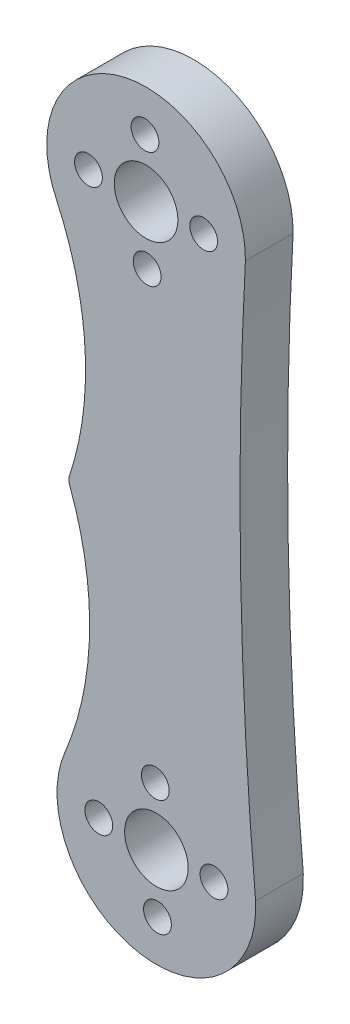
ISO-10303-21;
HEADER;
FILE_DESCRIPTION(('STEP AP214'),'2;1');
FILE_NAME('part.step','',(''),(''),'','','');
FILE_SCHEMA(('AUTOMOTIVE_DESIGN { 1 0 10303 214 1 1 1 1 }'));
ENDSEC;
DATA;
#1=APPLICATION_CONTEXT('core data for automotive mechanical design processes');
#2=APPLICATION_PROTOCOL_DEFINITION('international standard','automotive_design',2000,#1);
#3=PRODUCT_CONTEXT('',#1,'mechanical');
#4=PRODUCT('Part','Part','',(#3));
#5=PRODUCT_RELATED_PRODUCT_CATEGORY('part','',(#4));
#6=PRODUCT_DEFINITION_FORMATION('','',#4);
#7=PRODUCT_DEFINITION_CONTEXT('part definition',#1,'design');
#8=PRODUCT_DEFINITION('design','',#6,#7);
#9=PRODUCT_DEFINITION_SHAPE('','',#8);
#10=(LENGTH_UNIT() NAMED_UNIT(*) SI_UNIT(.MILLI.,.METRE.));
#11=(NAMED_UNIT(*) PLANE_ANGLE_UNIT() SI_UNIT($,.RADIAN.));
#12=(NAMED_UNIT(*) SI_UNIT($,.STERADIAN.) SOLID_ANGLE_UNIT());
#13=UNCERTAINTY_MEASURE_WITH_UNIT(LENGTH_MEASURE(1.E-05),#10,'distance_accuracy_value','');
#14=(GEOMETRIC_REPRESENTATION_CONTEXT(3) GLOBAL_UNCERTAINTY_ASSIGNED_CONTEXT((#13)) GLOBAL_UNIT_ASSIGNED_CONTEXT((#10,
#11,#12)) REPRESENTATION_CONTEXT('',''));
#15=CARTESIAN_POINT('',(0.,0.,0.));
#16=DIRECTION('',(0.,0.,1.));
#17=DIRECTION('',(1.,0.,0.));
#18=AXIS2_PLACEMENT_3D('',#15,#16,#17);
#19=CARTESIAN_POINT('',(0.,0.,0.));
#20=DIRECTION('',(0.,0.,-1.));
#21=DIRECTION('',(-1.,0.,0.));
#22=AXIS2_PLACEMENT_3D('',#19,#20,#21);
#23=PLANE('',#22);
#24=CARTESIAN_POINT('',(6.28299695814358,35.7797986204869,0.));
#25=DIRECTION('',(0.,0.,-1.));
#26=DIRECTION('',(-1.,0.,0.));
#27=AXIS2_PLACEMENT_3D('',#24,#25,#26);
#28=CIRCLE('',#27,1.75);
#29=CARTESIAN_POINT('',(4.53299695814358,35.7797986204869,0.));
#30=VERTEX_POINT('',#29);
#31=EDGE_CURVE('E315',#30,#30,#28,.T.);
#32=ORIENTED_EDGE('',*,*,#31,.F.);
#33=EDGE_LOOP('',(#32));
#34=FACE_BOUND('',#33,.T.);
#35=CARTESIAN_POINT('',(0.33320967582327,-34.3426837321449,0.));
#36=DIRECTION('',(0.,0.,-1.));
#37=DIRECTION('',(-1.,0.,0.));
#38=AXIS2_PLACEMENT_3D('',#35,#36,#37);
#39=CIRCLE('',#38,3.99999999999999);
#40=CARTESIAN_POINT('',(-3.66679032417672,-34.3426837321449,0.));
#41=VERTEX_POINT('',#40);
#42=EDGE_CURVE('E319',#41,#41,#39,.T.);
#43=ORIENTED_EDGE('',*,*,#42,.F.);
#44=EDGE_LOOP('',(#43));
#45=FACE_BOUND('',#44,.T.);
#46=CARTESIAN_POINT('',(0.198674082808035,-27.0939321034704,0.));
#47=DIRECTION('',(0.,0.,-1.));
#48=DIRECTION('',(-1.,0.,0.));
#49=AXIS2_PLACEMENT_3D('',#46,#47,#48);
#50=CIRCLE('',#49,1.75);
#51=CARTESIAN_POINT('',(-1.55132591719197,-27.0939321034704,0.));
#52=VERTEX_POINT('',#51);
#53=EDGE_CURVE('E323',#52,#52,#50,.T.);
#54=ORIENTED_EDGE('',*,*,#53,.F.);
#55=EDGE_LOOP('',(#54));
#56=FACE_BOUND('',#55,.T.);
#57=CARTESIAN_POINT('',(-6.91554195285128,-34.4772193251602,0.));
#58=DIRECTION('',(0.,0.,-1.));
#59=DIRECTION('',(-1.,0.,0.));
#60=AXIS2_PLACEMENT_3D('',#57,#58,#59);
#61=CIRCLE('',#60,1.75);
#62=CARTESIAN_POINT('',(-8.66554195285128,-34.4772193251602,0.));
#63=VERTEX_POINT('',#62);
#64=EDGE_CURVE('E327',#63,#63,#61,.T.);
#65=ORIENTED_EDGE('',*,*,#64,.F.);
#66=EDGE_LOOP('',(#65));
#67=FACE_BOUND('',#66,.T.);
#68=CARTESIAN_POINT('',(-0.965754670530769,35.6452630274715,0.));
#69=DIRECTION('',(0.,0.,-1.));
#70=DIRECTION('',(-1.,0.,0.));
#71=AXIS2_PLACEMENT_3D('',#68,#69,#70);
#72=CIRCLE('',#71,4.);
#73=CARTESIAN_POINT('',(-4.96575467053077,35.6452630274715,0.));
#74=VERTEX_POINT('',#73);
#75=EDGE_CURVE('E331',#74,#74,#72,.T.);
#76=ORIENTED_EDGE('',*,*,#75,.F.);
#77=EDGE_LOOP('',(#76));
#78=FACE_BOUND('',#77,.T.);
#79=CARTESIAN_POINT('',(-1.10029026354642,42.894014656146,0.));
#80=DIRECTION('',(0.,0.,-1.));
#81=DIRECTION('',(-1.,0.,0.));
#82=AXIS2_PLACEMENT_3D('',#79,#80,#81);
#83=CIRCLE('',#82,1.75);
#84=CARTESIAN_POINT('',(-2.85029026354642,42.894014656146,0.));
#85=VERTEX_POINT('',#84);
#86=EDGE_CURVE('E259',#85,#85,#83,.T.);
#87=ORIENTED_EDGE('',*,*,#86,.F.);
#88=EDGE_LOOP('',(#87));
#89=FACE_BOUND('',#88,.T.);
#90=CARTESIAN_POINT('',(-8.21450629920553,35.510727434456,0.));
#91=DIRECTION('',(0.,0.,-1.));
#92=DIRECTION('',(-1.,0.,0.));
#93=AXIS2_PLACEMENT_3D('',#90,#91,#92);
#94=CIRCLE('',#93,1.75000000000001);
#95=CARTESIAN_POINT('',(-9.96450629920554,35.510727434456,0.));
#96=VERTEX_POINT('',#95);
#97=EDGE_CURVE('E338',#96,#96,#94,.T.);
#98=ORIENTED_EDGE('',*,*,#97,.F.);
#99=EDGE_LOOP('',(#98));
#100=FACE_BOUND('',#99,.T.);
#101=CARTESIAN_POINT('',(-0.831219077515529,28.3965113987969,0.));
#102=DIRECTION('',(0.,0.,-1.));
#103=DIRECTION('',(-1.,0.,0.));
#104=AXIS2_PLACEMENT_3D('',#101,#102,#103);
#105=CIRCLE('',#104,1.75);
#106=CARTESIAN_POINT('',(-2.58121907751553,28.3965113987969,0.));
#107=VERTEX_POINT('',#106);
#108=EDGE_CURVE('E342',#107,#107,#105,.T.);
#109=ORIENTED_EDGE('',*,*,#108,.F.);
#110=EDGE_LOOP('',(#109));
#111=FACE_BOUND('',#110,.T.);
#112=CARTESIAN_POINT('',(7.58196130449783,-34.2081481391297,0.));
#113=DIRECTION('',(0.,0.,-1.));
#114=DIRECTION('',(-1.,0.,0.));
#115=AXIS2_PLACEMENT_3D('',#112,#113,#114);
#116=CIRCLE('',#115,1.75);
#117=CARTESIAN_POINT('',(5.83196130449783,-34.2081481391297,0.));
#118=VERTEX_POINT('',#117);
#119=EDGE_CURVE('E346',#118,#118,#116,.T.);
#120=ORIENTED_EDGE('',*,*,#119,.F.);
#121=EDGE_LOOP('',(#120));
#122=FACE_BOUND('',#121,.T.);
#123=CARTESIAN_POINT('',(0.467745268838516,-41.5914353608195,0.));
#124=DIRECTION('',(0.,0.,-1.));
#125=DIRECTION('',(-1.,0.,0.));
#126=AXIS2_PLACEMENT_3D('',#123,#124,#125);
#127=CIRCLE('',#126,1.75);
#128=CARTESIAN_POINT('',(-1.28225473116149,-41.5914353608195,0.));
#129=VERTEX_POINT('',#128);
#130=EDGE_CURVE('E349',#129,#129,#127,.T.);
#131=ORIENTED_EDGE('',*,*,#130,.F.);
#132=EDGE_LOOP('',(#131));
#133=FACE_BOUND('',#132,.T.);
#134=CARTESIAN_POINT('',(-0.965754670530769,35.6452630274715,0.));
#135=DIRECTION('',(0.,0.,-1.));
#136=DIRECTION('',(-1.,0.,0.));
#137=AXIS2_PLACEMENT_3D('',#134,#135,#136);
#138=CIRCLE('',#137,12.5);
#139=CARTESIAN_POINT('',(11.5324563655126,35.4337898648138,0.));
#140=VERTEX_POINT('',#139);
#141=CARTESIAN_POINT('',(-12.3021076636113,30.378660629694,0.));
#142=VERTEX_POINT('',#141);
#143=EDGE_CURVE('E270',#140,#142,#138,.F.);
#144=ORIENTED_EDGE('',*,*,#143,.F.);
#145=CARTESIAN_POINT('',(492.057121812476,9.78965580803227,0.));
#146=DIRECTION('',(0.,0.,-1.));
#147=DIRECTION('',(-1.,0.,0.));
#148=AXIS2_PLACEMENT_3D('',#145,#146,#147);
#149=CIRCLE('',#148,481.208453494365);
#150=CARTESIAN_POINT('',(12.8149661191944,-33.6675866366365,0.));
#151=VERTEX_POINT('',#150);
#152=EDGE_CURVE('E207',#140,#151,#149,.F.);
#153=ORIENTED_EDGE('',*,*,#152,.T.);
#154=CARTESIAN_POINT('',(0.33320967582327,-34.3426837321449,0.));
#155=DIRECTION('',(0.,0.,-1.));
#156=DIRECTION('',(-1.,0.,0.));
#157=AXIS2_PLACEMENT_3D('',#154,#155,#156);
#158=CIRCLE('',#157,12.5);
#159=CARTESIAN_POINT('',(-11.190763166557,-29.5003650800857,0.));
#160=VERTEX_POINT('',#159);
#161=EDGE_CURVE('E253',#151,#160,#158,.T.);
#162=ORIENTED_EDGE('',*,*,#161,.T.);
#163=CARTESIAN_POINT('',(-48.0674762621738,-14.0049453934962,0.));
#164=DIRECTION('',(0.,0.,-1.));
#165=DIRECTION('',(-1.,0.,0.));
#166=AXIS2_PLACEMENT_3D('',#163,#164,#165);
#167=CIRCLE('',#166,39.9999999999997);
#168=CARTESIAN_POINT('',(-10.5855212879354,-0.0370160083244973,0.));
#169=VERTEX_POINT('',#168);
#170=EDGE_CURVE('E256',#160,#169,#167,.F.);
#171=ORIENTED_EDGE('',*,*,#170,.T.);
#172=CARTESIAN_POINT('',(-9.17994797640146,0.486781343619437,0.));
#173=DIRECTION('',(0.,0.,-1.));
#174=DIRECTION('',(-1.,0.,0.));
#175=AXIS2_PLACEMENT_3D('',#172,#173,#174);
#176=CIRCLE('',#175,1.49999999999999);
#177=CARTESIAN_POINT('',(-10.6039897570665,0.958061522409341,0.));
#178=VERTEX_POINT('',#177);
#179=EDGE_CURVE('E276',#178,#169,#176,.F.);
#180=ORIENTED_EDGE('',*,*,#179,.F.);
#181=CARTESIAN_POINT('',(-48.5784372414688,13.5255329568061,0.));
#182=DIRECTION('',(0.,0.,-1.));
#183=DIRECTION('',(-1.,0.,0.));
#184=AXIS2_PLACEMENT_3D('',#181,#182,#183);
#185=CIRCLE('',#184,40.);
#186=EDGE_CURVE('E273',#142,#178,#185,.T.);
#187=ORIENTED_EDGE('',*,*,#186,.F.);
#188=EDGE_LOOP('',(#144,#153,#162,#171,#180,#187));
#189=FACE_BOUND('',#188,.T.);
#190=ADVANCED_FACE('F184',(#34,#45,#56,#67,#78,#89,#100,#111,#122,#133,#189),#23,.T.);
#191=CARTESIAN_POINT('',(492.057121812476,9.78965580803227,6.));
#192=DIRECTION('',(0.,0.,-1.));
#193=DIRECTION('',(-1.,0.,0.));
#194=AXIS2_PLACEMENT_3D('',#191,#192,#193);
#195=CYLINDRICAL_SURFACE('',#194,481.208453494365);
#196=ORIENTED_EDGE('',*,*,#152,.F.);
#197=DIRECTION('',(0.,0.,-1.));
#198=VECTOR('',#197,1.);
#199=CARTESIAN_POINT('',(11.5324563655126,35.4337898648138,6.));
#200=LINE('',#199,#198);
#201=CARTESIAN_POINT('',(11.5324563655126,35.4337898648138,6.));
#202=VERTEX_POINT('',#201);
#203=EDGE_CURVE('E187',#202,#140,#200,.T.);
#204=ORIENTED_EDGE('',*,*,#203,.F.);
#205=CARTESIAN_POINT('',(492.057121812476,9.78965580803227,6.));
#206=DIRECTION('',(0.,0.,-1.));
#207=DIRECTION('',(-1.,0.,0.));
#208=AXIS2_PLACEMENT_3D('',#205,#206,#207);
#209=CIRCLE('',#208,481.208453494365);
#210=CARTESIAN_POINT('',(12.8149661191944,-33.6675866366365,6.));
#211=VERTEX_POINT('',#210);
#212=EDGE_CURVE('E238',#202,#211,#209,.F.);
#213=ORIENTED_EDGE('',*,*,#212,.T.);
#214=DIRECTION('',(0.,0.,-1.));
#215=VECTOR('',#214,1.);
#216=CARTESIAN_POINT('',(12.8149661191944,-33.6675866366365,6.));
#217=LINE('',#216,#215);
#218=EDGE_CURVE('E12',#211,#151,#217,.T.);
#219=ORIENTED_EDGE('',*,*,#218,.T.);
#220=EDGE_LOOP('',(#196,#204,#213,#219));
#221=FACE_BOUND('',#220,.T.);
#222=ADVANCED_FACE('F236',(#221),#195,.F.);
#223=CARTESIAN_POINT('',(0.33320967582327,-34.3426837321449,6.));
#224=DIRECTION('',(0.,0.,-1.));
#225=DIRECTION('',(-1.,0.,0.));
#226=AXIS2_PLACEMENT_3D('',#223,#224,#225);
#227=CYLINDRICAL_SURFACE('',#226,12.5);
#228=ORIENTED_EDGE('',*,*,#161,.F.);
#229=ORIENTED_EDGE('',*,*,#218,.F.);
#230=CARTESIAN_POINT('',(0.33320967582327,-34.3426837321449,6.));
#231=DIRECTION('',(0.,0.,-1.));
#232=DIRECTION('',(-1.,0.,0.));
#233=AXIS2_PLACEMENT_3D('',#230,#231,#232);
#234=CIRCLE('',#233,12.5);
#235=CARTESIAN_POINT('',(-11.190763166557,-29.5003650800857,6.));
#236=VERTEX_POINT('',#235);
#237=EDGE_CURVE('E244',#211,#236,#234,.T.);
#238=ORIENTED_EDGE('',*,*,#237,.T.);
#239=DIRECTION('',(0.,0.,-1.));
#240=VECTOR('',#239,1.);
#241=CARTESIAN_POINT('',(-11.190763166557,-29.5003650800857,6.));
#242=LINE('',#241,#240);
#243=EDGE_CURVE('E192',#236,#160,#242,.T.);
#244=ORIENTED_EDGE('',*,*,#243,.T.);
#245=EDGE_LOOP('',(#228,#229,#238,#244));
#246=FACE_BOUND('',#245,.T.);
#247=ADVANCED_FACE('F298',(#246),#227,.T.);
#248=CARTESIAN_POINT('',(-48.0674762621738,-14.0049453934962,6.));
#249=DIRECTION('',(0.,0.,-1.));
#250=DIRECTION('',(-1.,0.,0.));
#251=AXIS2_PLACEMENT_3D('',#248,#249,#250);
#252=CYLINDRICAL_SURFACE('',#251,39.9999999999997);
#253=ORIENTED_EDGE('',*,*,#170,.F.);
#254=ORIENTED_EDGE('',*,*,#243,.F.);
#255=CARTESIAN_POINT('',(-48.0674762621738,-14.0049453934962,6.));
#256=DIRECTION('',(0.,0.,-1.));
#257=DIRECTION('',(-1.,0.,0.));
#258=AXIS2_PLACEMENT_3D('',#255,#256,#257);
#259=CIRCLE('',#258,39.9999999999997);
#260=CARTESIAN_POINT('',(-10.5855212879354,-0.0370160083244973,6.));
#261=VERTEX_POINT('',#260);
#262=EDGE_CURVE('E266',#236,#261,#259,.F.);
#263=ORIENTED_EDGE('',*,*,#262,.T.);
#264=DIRECTION('',(0.,0.,-1.));
#265=VECTOR('',#264,1.);
#266=CARTESIAN_POINT('',(-10.5855212879354,-0.0370160083244973,6.));
#267=LINE('',#266,#265);
#268=EDGE_CURVE('E282',#261,#169,#267,.T.);
#269=ORIENTED_EDGE('',*,*,#268,.T.);
#270=EDGE_LOOP('',(#253,#254,#263,#269));
#271=FACE_BOUND('',#270,.T.);
#272=ADVANCED_FACE('F296',(#271),#252,.F.);
#273=CARTESIAN_POINT('',(-9.17994797640146,0.486781343619437,6.));
#274=DIRECTION('',(0.,0.,-1.));
#275=DIRECTION('',(-1.,0.,0.));
#276=AXIS2_PLACEMENT_3D('',#273,#274,#275);
#277=CYLINDRICAL_SURFACE('',#276,1.49999999999999);
#278=ORIENTED_EDGE('',*,*,#179,.T.);
#279=ORIENTED_EDGE('',*,*,#268,.F.);
#280=CARTESIAN_POINT('',(-9.17994797640146,0.486781343619437,6.));
#281=DIRECTION('',(0.,0.,-1.));
#282=DIRECTION('',(-1.,0.,0.));
#283=AXIS2_PLACEMENT_3D('',#280,#281,#282);
#284=CIRCLE('',#283,1.49999999999999);
#285=CARTESIAN_POINT('',(-10.6039897570665,0.958061522409341,6.));
#286=VERTEX_POINT('',#285);
#287=EDGE_CURVE('E263',#286,#261,#284,.F.);
#288=ORIENTED_EDGE('',*,*,#287,.F.);
#289=DIRECTION('',(0.,0.,-1.));
#290=VECTOR('',#289,1.);
#291=CARTESIAN_POINT('',(-10.6039897570665,0.958061522409341,6.));
#292=LINE('',#291,#290);
#293=EDGE_CURVE('E284',#286,#178,#292,.T.);
#294=ORIENTED_EDGE('',*,*,#293,.T.);
#295=EDGE_LOOP('',(#278,#279,#288,#294));
#296=FACE_BOUND('',#295,.T.);
#297=ADVANCED_FACE('F292',(#296),#277,.T.);
#298=CARTESIAN_POINT('',(-48.5784372414688,13.5255329568061,6.));
#299=DIRECTION('',(0.,0.,-1.));
#300=DIRECTION('',(-1.,0.,0.));
#301=AXIS2_PLACEMENT_3D('',#298,#299,#300);
#302=CYLINDRICAL_SURFACE('',#301,40.);
#303=ORIENTED_EDGE('',*,*,#186,.T.);
#304=ORIENTED_EDGE('',*,*,#293,.F.);
#305=CARTESIAN_POINT('',(-48.5784372414688,13.5255329568061,6.));
#306=DIRECTION('',(0.,0.,-1.));
#307=DIRECTION('',(-1.,0.,0.));
#308=AXIS2_PLACEMENT_3D('',#305,#306,#307);
#309=CIRCLE('',#308,40.);
#310=CARTESIAN_POINT('',(-12.3021076636112,30.378660629694,6.));
#311=VERTEX_POINT('',#310);
#312=EDGE_CURVE('E200',#311,#286,#309,.T.);
#313=ORIENTED_EDGE('',*,*,#312,.F.);
#314=DIRECTION('',(0.,0.,-1.));
#315=VECTOR('',#314,1.);
#316=CARTESIAN_POINT('',(-12.3021076636113,30.378660629694,6.));
#317=LINE('',#316,#315);
#318=EDGE_CURVE('E243',#311,#142,#317,.T.);
#319=ORIENTED_EDGE('',*,*,#318,.T.);
#320=EDGE_LOOP('',(#303,#304,#313,#319));
#321=FACE_BOUND('',#320,.T.);
#322=ADVANCED_FACE('F285',(#321),#302,.F.);
#323=CARTESIAN_POINT('',(-0.965754670530769,35.6452630274715,6.));
#324=DIRECTION('',(0.,0.,-1.));
#325=DIRECTION('',(-1.,0.,0.));
#326=AXIS2_PLACEMENT_3D('',#323,#324,#325);
#327=CYLINDRICAL_SURFACE('',#326,12.5);
#328=ORIENTED_EDGE('',*,*,#143,.T.);
#329=ORIENTED_EDGE('',*,*,#318,.F.);
#330=CARTESIAN_POINT('',(-0.965754670530769,35.6452630274715,6.));
#331=DIRECTION('',(0.,0.,-1.));
#332=DIRECTION('',(-1.,0.,0.));
#333=AXIS2_PLACEMENT_3D('',#330,#331,#332);
#334=CIRCLE('',#333,12.5);
#335=EDGE_CURVE('E246',#202,#311,#334,.F.);
#336=ORIENTED_EDGE('',*,*,#335,.F.);
#337=ORIENTED_EDGE('',*,*,#203,.T.);
#338=EDGE_LOOP('',(#328,#329,#336,#337));
#339=FACE_BOUND('',#338,.T.);
#340=ADVANCED_FACE('F247',(#339),#327,.T.);
#341=CARTESIAN_POINT('',(0.467745268838516,-41.5914353608195,6.));
#342=DIRECTION('',(0.,0.,-1.));
#343=DIRECTION('',(-1.,0.,0.));
#344=AXIS2_PLACEMENT_3D('',#341,#342,#343);
#345=CYLINDRICAL_SURFACE('',#344,1.75);
#346=CARTESIAN_POINT('',(0.467745268838516,-41.5914353608195,6.));
#347=DIRECTION('',(0.,0.,-1.));
#348=DIRECTION('',(-1.,0.,0.));
#349=AXIS2_PLACEMENT_3D('',#346,#347,#348);
#350=CIRCLE('',#349,1.75);
#351=CARTESIAN_POINT('',(-1.28225473116149,-41.5914353608195,6.));
#352=VERTEX_POINT('',#351);
#353=EDGE_CURVE('E351',#352,#352,#350,.T.);
#354=ORIENTED_EDGE('',*,*,#353,.F.);
#355=EDGE_LOOP('',(#354));
#356=FACE_BOUND('',#355,.T.);
#357=ORIENTED_EDGE('',*,*,#130,.T.);
#358=EDGE_LOOP('',(#357));
#359=FACE_BOUND('',#358,.T.);
#360=ADVANCED_FACE('F424',(#356,#359),#345,.F.);
#361=CARTESIAN_POINT('',(7.58196130449783,-34.2081481391297,6.));
#362=DIRECTION('',(0.,0.,-1.));
#363=DIRECTION('',(-1.,0.,0.));
#364=AXIS2_PLACEMENT_3D('',#361,#362,#363);
#365=CYLINDRICAL_SURFACE('',#364,1.75);
#366=CARTESIAN_POINT('',(7.58196130449783,-34.2081481391297,6.));
#367=DIRECTION('',(0.,0.,-1.));
#368=DIRECTION('',(-1.,0.,0.));
#369=AXIS2_PLACEMENT_3D('',#366,#367,#368);
#370=CIRCLE('',#369,1.75);
#371=CARTESIAN_POINT('',(5.83196130449783,-34.2081481391297,6.));
#372=VERTEX_POINT('',#371);
#373=EDGE_CURVE('E365',#372,#372,#370,.T.);
#374=ORIENTED_EDGE('',*,*,#373,.F.);
#375=EDGE_LOOP('',(#374));
#376=FACE_BOUND('',#375,.T.);
#377=ORIENTED_EDGE('',*,*,#119,.T.);
#378=EDGE_LOOP('',(#377));
#379=FACE_BOUND('',#378,.T.);
#380=ADVANCED_FACE('F406',(#376,#379),#365,.F.);
#381=CARTESIAN_POINT('',(-0.831219077515529,28.3965113987969,6.));
#382=DIRECTION('',(0.,0.,-1.));
#383=DIRECTION('',(-1.,0.,0.));
#384=AXIS2_PLACEMENT_3D('',#381,#382,#383);
#385=CYLINDRICAL_SURFACE('',#384,1.75);
#386=CARTESIAN_POINT('',(-0.831219077515529,28.3965113987969,6.));
#387=DIRECTION('',(0.,0.,-1.));
#388=DIRECTION('',(-1.,0.,0.));
#389=AXIS2_PLACEMENT_3D('',#386,#387,#388);
#390=CIRCLE('',#389,1.75);
#391=CARTESIAN_POINT('',(-2.58121907751553,28.3965113987969,6.));
#392=VERTEX_POINT('',#391);
#393=EDGE_CURVE('E378',#392,#392,#390,.T.);
#394=ORIENTED_EDGE('',*,*,#393,.F.);
#395=EDGE_LOOP('',(#394));
#396=FACE_BOUND('',#395,.T.);
#397=ORIENTED_EDGE('',*,*,#108,.T.);
#398=EDGE_LOOP('',(#397));
#399=FACE_BOUND('',#398,.T.);
#400=ADVANCED_FACE('F401',(#396,#399),#385,.F.);
#401=CARTESIAN_POINT('',(-8.21450629920553,35.510727434456,6.));
#402=DIRECTION('',(0.,0.,-1.));
#403=DIRECTION('',(-1.,0.,0.));
#404=AXIS2_PLACEMENT_3D('',#401,#402,#403);
#405=CYLINDRICAL_SURFACE('',#404,1.75000000000001);
#406=CARTESIAN_POINT('',(-8.21450629920553,35.510727434456,6.));
#407=DIRECTION('',(0.,0.,-1.));
#408=DIRECTION('',(-1.,0.,0.));
#409=AXIS2_PLACEMENT_3D('',#406,#407,#408);
#410=CIRCLE('',#409,1.75000000000001);
#411=CARTESIAN_POINT('',(-9.96450629920554,35.510727434456,6.));
#412=VERTEX_POINT('',#411);
#413=EDGE_CURVE('E374',#412,#412,#410,.T.);
#414=ORIENTED_EDGE('',*,*,#413,.F.);
#415=EDGE_LOOP('',(#414));
#416=FACE_BOUND('',#415,.T.);
#417=ORIENTED_EDGE('',*,*,#97,.T.);
#418=EDGE_LOOP('',(#417));
#419=FACE_BOUND('',#418,.T.);
#420=ADVANCED_FACE('F392',(#416,#419),#405,.F.);
#421=CARTESIAN_POINT('',(-1.10029026354642,42.894014656146,6.));
#422=DIRECTION('',(0.,0.,-1.));
#423=DIRECTION('',(-1.,0.,0.));
#424=AXIS2_PLACEMENT_3D('',#421,#422,#423);
#425=CYLINDRICAL_SURFACE('',#424,1.75);
#426=CARTESIAN_POINT('',(-1.10029026354642,42.894014656146,6.));
#427=DIRECTION('',(0.,0.,-1.));
#428=DIRECTION('',(-1.,0.,0.));
#429=AXIS2_PLACEMENT_3D('',#426,#427,#428);
#430=CIRCLE('',#429,1.75);
#431=CARTESIAN_POINT('',(-2.85029026354642,42.894014656146,6.));
#432=VERTEX_POINT('',#431);
#433=EDGE_CURVE('E384',#432,#432,#430,.T.);
#434=ORIENTED_EDGE('',*,*,#433,.F.);
#435=EDGE_LOOP('',(#434));
#436=FACE_BOUND('',#435,.T.);
#437=ORIENTED_EDGE('',*,*,#86,.T.);
#438=EDGE_LOOP('',(#437));
#439=FACE_BOUND('',#438,.T.);
#440=ADVANCED_FACE('F389',(#436,#439),#425,.F.);
#441=CARTESIAN_POINT('',(-0.965754670530769,35.6452630274715,6.));
#442=DIRECTION('',(0.,0.,-1.));
#443=DIRECTION('',(-1.,0.,0.));
#444=AXIS2_PLACEMENT_3D('',#441,#442,#443);
#445=CYLINDRICAL_SURFACE('',#444,4.);
#446=CARTESIAN_POINT('',(-0.965754670530769,35.6452630274715,6.));
#447=DIRECTION('',(0.,0.,-1.));
#448=DIRECTION('',(-1.,0.,0.));
#449=AXIS2_PLACEMENT_3D('',#446,#447,#448);
#450=CIRCLE('',#449,4.);
#451=CARTESIAN_POINT('',(-4.96575467053077,35.6452630274715,6.));
#452=VERTEX_POINT('',#451);
#453=EDGE_CURVE('E271',#452,#452,#450,.T.);
#454=ORIENTED_EDGE('',*,*,#453,.F.);
#455=EDGE_LOOP('',(#454));
#456=FACE_BOUND('',#455,.T.);
#457=ORIENTED_EDGE('',*,*,#75,.T.);
#458=EDGE_LOOP('',(#457));
#459=FACE_BOUND('',#458,.T.);
#460=ADVANCED_FACE('F391',(#456,#459),#445,.F.);
#461=CARTESIAN_POINT('',(-6.91554195285128,-34.4772193251602,6.));
#462=DIRECTION('',(0.,0.,-1.));
#463=DIRECTION('',(-1.,0.,0.));
#464=AXIS2_PLACEMENT_3D('',#461,#462,#463);
#465=CYLINDRICAL_SURFACE('',#464,1.75);
#466=CARTESIAN_POINT('',(-6.91554195285128,-34.4772193251602,6.));
#467=DIRECTION('',(0.,0.,-1.));
#468=DIRECTION('',(-1.,0.,0.));
#469=AXIS2_PLACEMENT_3D('',#466,#467,#468);
#470=CIRCLE('',#469,1.75);
#471=CARTESIAN_POINT('',(-8.66554195285128,-34.4772193251602,6.));
#472=VERTEX_POINT('',#471);
#473=EDGE_CURVE('E361',#472,#472,#470,.T.);
#474=ORIENTED_EDGE('',*,*,#473,.F.);
#475=EDGE_LOOP('',(#474));
#476=FACE_BOUND('',#475,.T.);
#477=ORIENTED_EDGE('',*,*,#64,.T.);
#478=EDGE_LOOP('',(#477));
#479=FACE_BOUND('',#478,.T.);
#480=ADVANCED_FACE('F398',(#476,#479),#465,.F.);
#481=CARTESIAN_POINT('',(0.198674082808035,-27.0939321034704,6.));
#482=DIRECTION('',(0.,0.,-1.));
#483=DIRECTION('',(-1.,0.,0.));
#484=AXIS2_PLACEMENT_3D('',#481,#482,#483);
#485=CYLINDRICAL_SURFACE('',#484,1.75);
#486=CARTESIAN_POINT('',(0.198674082808035,-27.0939321034704,6.));
#487=DIRECTION('',(0.,0.,-1.));
#488=DIRECTION('',(-1.,0.,0.));
#489=AXIS2_PLACEMENT_3D('',#486,#487,#488);
#490=CIRCLE('',#489,1.75);
#491=CARTESIAN_POINT('',(-1.55132591719197,-27.0939321034704,6.));
#492=VERTEX_POINT('',#491);
#493=EDGE_CURVE('E357',#492,#492,#490,.T.);
#494=ORIENTED_EDGE('',*,*,#493,.F.);
#495=EDGE_LOOP('',(#494));
#496=FACE_BOUND('',#495,.T.);
#497=ORIENTED_EDGE('',*,*,#53,.T.);
#498=EDGE_LOOP('',(#497));
#499=FACE_BOUND('',#498,.T.);
#500=ADVANCED_FACE('F413',(#496,#499),#485,.F.);
#501=CARTESIAN_POINT('',(0.33320967582327,-34.3426837321449,6.));
#502=DIRECTION('',(0.,0.,-1.));
#503=DIRECTION('',(-1.,0.,0.));
#504=AXIS2_PLACEMENT_3D('',#501,#502,#503);
#505=CYLINDRICAL_SURFACE('',#504,3.99999999999999);
#506=CARTESIAN_POINT('',(0.33320967582327,-34.3426837321449,6.));
#507=DIRECTION('',(0.,0.,-1.));
#508=DIRECTION('',(-1.,0.,0.));
#509=AXIS2_PLACEMENT_3D('',#506,#507,#508);
#510=CIRCLE('',#509,3.99999999999999);
#511=CARTESIAN_POINT('',(-3.66679032417672,-34.3426837321449,6.));
#512=VERTEX_POINT('',#511);
#513=EDGE_CURVE('E370',#512,#512,#510,.T.);
#514=ORIENTED_EDGE('',*,*,#513,.F.);
#515=EDGE_LOOP('',(#514));
#516=FACE_BOUND('',#515,.T.);
#517=ORIENTED_EDGE('',*,*,#42,.T.);
#518=EDGE_LOOP('',(#517));
#519=FACE_BOUND('',#518,.T.);
#520=ADVANCED_FACE('F409',(#516,#519),#505,.F.);
#521=CARTESIAN_POINT('',(6.28299695814358,35.7797986204869,6.));
#522=DIRECTION('',(0.,0.,-1.));
#523=DIRECTION('',(-1.,0.,0.));
#524=AXIS2_PLACEMENT_3D('',#521,#522,#523);
#525=CYLINDRICAL_SURFACE('',#524,1.75);
#526=CARTESIAN_POINT('',(6.28299695814358,35.7797986204869,6.));
#527=DIRECTION('',(0.,0.,-1.));
#528=DIRECTION('',(-1.,0.,0.));
#529=AXIS2_PLACEMENT_3D('',#526,#527,#528);
#530=CIRCLE('',#529,1.75);
#531=CARTESIAN_POINT('',(4.53299695814358,35.7797986204869,6.));
#532=VERTEX_POINT('',#531);
#533=EDGE_CURVE('E366',#532,#532,#530,.T.);
#534=ORIENTED_EDGE('',*,*,#533,.F.);
#535=EDGE_LOOP('',(#534));
#536=FACE_BOUND('',#535,.T.);
#537=ORIENTED_EDGE('',*,*,#31,.T.);
#538=EDGE_LOOP('',(#537));
#539=FACE_BOUND('',#538,.T.);
#540=ADVANCED_FACE('F412',(#536,#539),#525,.F.);
#541=CARTESIAN_POINT('',(0.,0.,6.));
#542=DIRECTION('',(0.,0.,-1.));
#543=DIRECTION('',(-1.,0.,0.));
#544=AXIS2_PLACEMENT_3D('',#541,#542,#543);
#545=PLANE('',#544);
#546=ORIENTED_EDGE('',*,*,#533,.T.);
#547=EDGE_LOOP('',(#546));
#548=FACE_BOUND('',#547,.T.);
#549=ORIENTED_EDGE('',*,*,#513,.T.);
#550=EDGE_LOOP('',(#549));
#551=FACE_BOUND('',#550,.T.);
#552=ORIENTED_EDGE('',*,*,#493,.T.);
#553=EDGE_LOOP('',(#552));
#554=FACE_BOUND('',#553,.T.);
#555=ORIENTED_EDGE('',*,*,#473,.T.);
#556=EDGE_LOOP('',(#555));
#557=FACE_BOUND('',#556,.T.);
#558=ORIENTED_EDGE('',*,*,#453,.T.);
#559=EDGE_LOOP('',(#558));
#560=FACE_BOUND('',#559,.T.);
#561=ORIENTED_EDGE('',*,*,#433,.T.);
#562=EDGE_LOOP('',(#561));
#563=FACE_BOUND('',#562,.T.);
#564=ORIENTED_EDGE('',*,*,#413,.T.);
#565=EDGE_LOOP('',(#564));
#566=FACE_BOUND('',#565,.T.);
#567=ORIENTED_EDGE('',*,*,#393,.T.);
#568=EDGE_LOOP('',(#567));
#569=FACE_BOUND('',#568,.T.);
#570=ORIENTED_EDGE('',*,*,#373,.T.);
#571=EDGE_LOOP('',(#570));
#572=FACE_BOUND('',#571,.T.);
#573=ORIENTED_EDGE('',*,*,#353,.T.);
#574=EDGE_LOOP('',(#573));
#575=FACE_BOUND('',#574,.T.);
#576=ORIENTED_EDGE('',*,*,#212,.F.);
#577=ORIENTED_EDGE('',*,*,#335,.T.);
#578=ORIENTED_EDGE('',*,*,#312,.T.);
#579=ORIENTED_EDGE('',*,*,#287,.T.);
#580=ORIENTED_EDGE('',*,*,#262,.F.);
#581=ORIENTED_EDGE('',*,*,#237,.F.);
#582=EDGE_LOOP('',(#576,#577,#578,#579,#580,#581));
#583=FACE_BOUND('',#582,.T.);
#584=ADVANCED_FACE('F251',(#548,#551,#554,#557,#560,#563,#566,#569,#572,#575,#583),#545,.F.);
#585=CLOSED_SHELL('',(#190,#222,#247,#272,#297,#322,#340,#360,#380,#400,#420,#440,#460,#480,
#500,#520,#540,#584));
#586=MANIFOLD_SOLID_BREP('B2',#585);
#587=ADVANCED_BREP_SHAPE_REPRESENTATION('',(#18,#586),#14);
#588=SHAPE_DEFINITION_REPRESENTATION(#9,#587);
ENDSEC;
END-ISO-10303-21;
